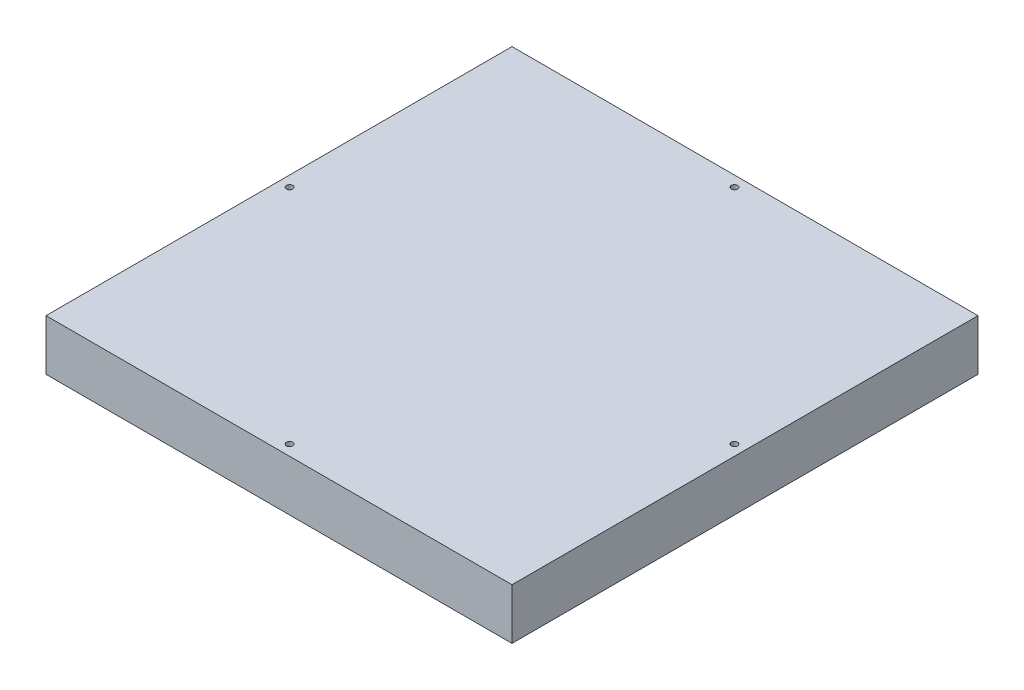
ISO-10303-21;
HEADER;
FILE_DESCRIPTION(('STEP AP214'),'2;1');
FILE_NAME('part.step','',(''),(''),'','','');
FILE_SCHEMA(('AUTOMOTIVE_DESIGN { 1 0 10303 214 1 1 1 1 }'));
ENDSEC;
DATA;
#1=APPLICATION_CONTEXT('core data for automotive mechanical design processes');
#2=APPLICATION_PROTOCOL_DEFINITION('international standard','automotive_design',2000,#1);
#3=PRODUCT_CONTEXT('',#1,'mechanical');
#4=PRODUCT('Part','Part','',(#3));
#5=PRODUCT_RELATED_PRODUCT_CATEGORY('part','',(#4));
#6=PRODUCT_DEFINITION_FORMATION('','',#4);
#7=PRODUCT_DEFINITION_CONTEXT('part definition',#1,'design');
#8=PRODUCT_DEFINITION('design','',#6,#7);
#9=PRODUCT_DEFINITION_SHAPE('','',#8);
#10=(LENGTH_UNIT() NAMED_UNIT(*) SI_UNIT(.MILLI.,.METRE.));
#11=(NAMED_UNIT(*) PLANE_ANGLE_UNIT() SI_UNIT($,.RADIAN.));
#12=(NAMED_UNIT(*) SI_UNIT($,.STERADIAN.) SOLID_ANGLE_UNIT());
#13=UNCERTAINTY_MEASURE_WITH_UNIT(LENGTH_MEASURE(1.E-05),#10,'distance_accuracy_value','');
#14=(GEOMETRIC_REPRESENTATION_CONTEXT(3) GLOBAL_UNCERTAINTY_ASSIGNED_CONTEXT((#13)) GLOBAL_UNIT_ASSIGNED_CONTEXT((#10,
#11,#12)) REPRESENTATION_CONTEXT('',''));
#15=CARTESIAN_POINT('',(0.,0.,0.));
#16=DIRECTION('',(0.,0.,1.));
#17=DIRECTION('',(1.,0.,0.));
#18=AXIS2_PLACEMENT_3D('',#15,#16,#17);
#19=CARTESIAN_POINT('',(0.,24.,0.));
#20=DIRECTION('',(0.,-1.,0.));
#21=DIRECTION('',(0.,0.,-1.));
#22=AXIS2_PLACEMENT_3D('',#19,#20,#21);
#23=PLANE('',#22);
#24=DIRECTION('',(0.,0.,-1.));
#25=VECTOR('',#24,1.);
#26=CARTESIAN_POINT('',(110.,24.,110.));
#27=LINE('',#26,#25);
#28=CARTESIAN_POINT('',(110.,24.,110.));
#29=VERTEX_POINT('',#28);
#30=CARTESIAN_POINT('',(110.,24.,-110.));
#31=VERTEX_POINT('',#30);
#32=EDGE_CURVE('E101',#29,#31,#27,.T.);
#33=ORIENTED_EDGE('',*,*,#32,.T.);
#34=DIRECTION('',(-1.,0.,0.));
#35=VECTOR('',#34,1.);
#36=CARTESIAN_POINT('',(-110.,24.,-110.));
#37=LINE('',#36,#35);
#38=CARTESIAN_POINT('',(-110.,24.,-110.));
#39=VERTEX_POINT('',#38);
#40=EDGE_CURVE('E95',#31,#39,#37,.T.);
#41=ORIENTED_EDGE('',*,*,#40,.T.);
#42=DIRECTION('',(0.,0.,1.));
#43=VECTOR('',#42,1.);
#44=CARTESIAN_POINT('',(-110.,24.,110.));
#45=LINE('',#44,#43);
#46=CARTESIAN_POINT('',(-110.,24.,110.));
#47=VERTEX_POINT('',#46);
#48=EDGE_CURVE('E99',#39,#47,#45,.T.);
#49=ORIENTED_EDGE('',*,*,#48,.T.);
#50=DIRECTION('',(1.,0.,0.));
#51=VECTOR('',#50,1.);
#52=CARTESIAN_POINT('',(-110.,24.,110.));
#53=LINE('',#52,#51);
#54=EDGE_CURVE('E64',#47,#29,#53,.T.);
#55=ORIENTED_EDGE('',*,*,#54,.T.);
#56=EDGE_LOOP('',(#33,#41,#49,#55));
#57=FACE_BOUND('',#56,.T.);
#58=CARTESIAN_POINT('',(-105.,24.,0.));
#59=DIRECTION('',(0.,1.,0.));
#60=DIRECTION('',(0.,0.,1.));
#61=AXIS2_PLACEMENT_3D('',#58,#59,#60);
#62=CIRCLE('',#61,1.5);
#63=CARTESIAN_POINT('',(-105.,24.,1.5));
#64=VERTEX_POINT('',#63);
#65=EDGE_CURVE('E150',#64,#64,#62,.T.);
#66=ORIENTED_EDGE('',*,*,#65,.F.);
#67=EDGE_LOOP('',(#66));
#68=FACE_BOUND('',#67,.T.);
#69=CARTESIAN_POINT('',(105.,24.,0.));
#70=DIRECTION('',(0.,1.,0.));
#71=DIRECTION('',(0.,0.,1.));
#72=AXIS2_PLACEMENT_3D('',#69,#70,#71);
#73=CIRCLE('',#72,1.5);
#74=CARTESIAN_POINT('',(105.,24.,1.5));
#75=VERTEX_POINT('',#74);
#76=EDGE_CURVE('E142',#75,#75,#73,.T.);
#77=ORIENTED_EDGE('',*,*,#76,.F.);
#78=EDGE_LOOP('',(#77));
#79=FACE_BOUND('',#78,.T.);
#80=CARTESIAN_POINT('',(0.,24.,105.));
#81=DIRECTION('',(0.,1.,0.));
#82=DIRECTION('',(0.,0.,1.));
#83=AXIS2_PLACEMENT_3D('',#80,#81,#82);
#84=CIRCLE('',#83,1.5);
#85=CARTESIAN_POINT('',(0.,24.,106.5));
#86=VERTEX_POINT('',#85);
#87=EDGE_CURVE('E128',#86,#86,#84,.T.);
#88=ORIENTED_EDGE('',*,*,#87,.F.);
#89=EDGE_LOOP('',(#88));
#90=FACE_BOUND('',#89,.T.);
#91=CARTESIAN_POINT('',(0.,24.,-105.));
#92=DIRECTION('',(0.,1.,0.));
#93=DIRECTION('',(0.,0.,1.));
#94=AXIS2_PLACEMENT_3D('',#91,#92,#93);
#95=CIRCLE('',#94,1.5);
#96=CARTESIAN_POINT('',(0.,24.,-103.5));
#97=VERTEX_POINT('',#96);
#98=EDGE_CURVE('E141',#97,#97,#95,.T.);
#99=ORIENTED_EDGE('',*,*,#98,.F.);
#100=EDGE_LOOP('',(#99));
#101=FACE_BOUND('',#100,.T.);
#102=ADVANCED_FACE('F46',(#57,#68,#79,#90,#101),#23,.F.);
#103=CARTESIAN_POINT('',(0.,0.,0.));
#104=DIRECTION('',(0.,-1.,0.));
#105=DIRECTION('',(0.,0.,-1.));
#106=AXIS2_PLACEMENT_3D('',#103,#104,#105);
#107=PLANE('',#106);
#108=CARTESIAN_POINT('',(0.,0.,105.));
#109=DIRECTION('',(0.,1.,0.));
#110=DIRECTION('',(0.,0.,1.));
#111=AXIS2_PLACEMENT_3D('',#108,#109,#110);
#112=CIRCLE('',#111,1.5);
#113=CARTESIAN_POINT('',(0.,0.,106.5));
#114=VERTEX_POINT('',#113);
#115=EDGE_CURVE('E134',#114,#114,#112,.T.);
#116=ORIENTED_EDGE('',*,*,#115,.T.);
#117=EDGE_LOOP('',(#116));
#118=FACE_BOUND('',#117,.T.);
#119=CARTESIAN_POINT('',(-105.,0.,0.));
#120=DIRECTION('',(0.,1.,0.));
#121=DIRECTION('',(0.,0.,1.));
#122=AXIS2_PLACEMENT_3D('',#119,#120,#121);
#123=CIRCLE('',#122,1.5);
#124=CARTESIAN_POINT('',(-105.,0.,1.5));
#125=VERTEX_POINT('',#124);
#126=EDGE_CURVE('E146',#125,#125,#123,.T.);
#127=ORIENTED_EDGE('',*,*,#126,.T.);
#128=EDGE_LOOP('',(#127));
#129=FACE_BOUND('',#128,.T.);
#130=DIRECTION('',(0.,0.,-1.));
#131=VECTOR('',#130,1.);
#132=CARTESIAN_POINT('',(110.,0.,110.));
#133=LINE('',#132,#131);
#134=CARTESIAN_POINT('',(110.,0.,110.));
#135=VERTEX_POINT('',#134);
#136=CARTESIAN_POINT('',(110.,0.,-110.));
#137=VERTEX_POINT('',#136);
#138=EDGE_CURVE('E154',#135,#137,#133,.T.);
#139=ORIENTED_EDGE('',*,*,#138,.F.);
#140=DIRECTION('',(1.,0.,0.));
#141=VECTOR('',#140,1.);
#142=CARTESIAN_POINT('',(-110.,0.,110.));
#143=LINE('',#142,#141);
#144=CARTESIAN_POINT('',(-110.,0.,110.));
#145=VERTEX_POINT('',#144);
#146=EDGE_CURVE('E88',#145,#135,#143,.T.);
#147=ORIENTED_EDGE('',*,*,#146,.F.);
#148=DIRECTION('',(0.,0.,1.));
#149=VECTOR('',#148,1.);
#150=CARTESIAN_POINT('',(-110.,0.,110.));
#151=LINE('',#150,#149);
#152=CARTESIAN_POINT('',(-110.,0.,-110.));
#153=VERTEX_POINT('',#152);
#154=EDGE_CURVE('E82',#153,#145,#151,.T.);
#155=ORIENTED_EDGE('',*,*,#154,.F.);
#156=DIRECTION('',(-1.,0.,0.));
#157=VECTOR('',#156,1.);
#158=CARTESIAN_POINT('',(-110.,0.,-110.));
#159=LINE('',#158,#157);
#160=EDGE_CURVE('E106',#137,#153,#159,.T.);
#161=ORIENTED_EDGE('',*,*,#160,.F.);
#162=EDGE_LOOP('',(#139,#147,#155,#161));
#163=FACE_BOUND('',#162,.T.);
#164=CARTESIAN_POINT('',(105.,0.,0.));
#165=DIRECTION('',(0.,1.,0.));
#166=DIRECTION('',(0.,0.,1.));
#167=AXIS2_PLACEMENT_3D('',#164,#165,#166);
#168=CIRCLE('',#167,1.5);
#169=CARTESIAN_POINT('',(105.,0.,1.5));
#170=VERTEX_POINT('',#169);
#171=EDGE_CURVE('E133',#170,#170,#168,.T.);
#172=ORIENTED_EDGE('',*,*,#171,.T.);
#173=EDGE_LOOP('',(#172));
#174=FACE_BOUND('',#173,.T.);
#175=CARTESIAN_POINT('',(0.,0.,-105.));
#176=DIRECTION('',(0.,1.,0.));
#177=DIRECTION('',(0.,0.,1.));
#178=AXIS2_PLACEMENT_3D('',#175,#176,#177);
#179=CIRCLE('',#178,1.5);
#180=CARTESIAN_POINT('',(0.,0.,-103.5));
#181=VERTEX_POINT('',#180);
#182=EDGE_CURVE('E135',#181,#181,#179,.T.);
#183=ORIENTED_EDGE('',*,*,#182,.T.);
#184=EDGE_LOOP('',(#183));
#185=FACE_BOUND('',#184,.T.);
#186=ADVANCED_FACE('F209',(#118,#129,#163,#174,#185),#107,.T.);
#187=CARTESIAN_POINT('',(110.,24.,110.));
#188=DIRECTION('',(-1.,0.,0.));
#189=DIRECTION('',(0.,0.,1.));
#190=AXIS2_PLACEMENT_3D('',#187,#188,#189);
#191=PLANE('',#190);
#192=ORIENTED_EDGE('',*,*,#138,.T.);
#193=DIRECTION('',(0.,-1.,0.));
#194=VECTOR('',#193,1.);
#195=CARTESIAN_POINT('',(110.,24.,-110.));
#196=LINE('',#195,#194);
#197=EDGE_CURVE('E12',#31,#137,#196,.T.);
#198=ORIENTED_EDGE('',*,*,#197,.F.);
#199=ORIENTED_EDGE('',*,*,#32,.F.);
#200=DIRECTION('',(0.,-1.,0.));
#201=VECTOR('',#200,1.);
#202=CARTESIAN_POINT('',(110.,24.,110.));
#203=LINE('',#202,#201);
#204=EDGE_CURVE('E113',#29,#135,#203,.T.);
#205=ORIENTED_EDGE('',*,*,#204,.T.);
#206=EDGE_LOOP('',(#192,#198,#199,#205));
#207=FACE_BOUND('',#206,.T.);
#208=ADVANCED_FACE('F48',(#207),#191,.F.);
#209=CARTESIAN_POINT('',(-110.,24.,-110.));
#210=DIRECTION('',(0.,0.,1.));
#211=DIRECTION('',(1.,0.,0.));
#212=AXIS2_PLACEMENT_3D('',#209,#210,#211);
#213=PLANE('',#212);
#214=ORIENTED_EDGE('',*,*,#160,.T.);
#215=DIRECTION('',(0.,-1.,0.));
#216=VECTOR('',#215,1.);
#217=CARTESIAN_POINT('',(-110.,24.,-110.));
#218=LINE('',#217,#216);
#219=EDGE_CURVE('E56',#39,#153,#218,.T.);
#220=ORIENTED_EDGE('',*,*,#219,.F.);
#221=ORIENTED_EDGE('',*,*,#40,.F.);
#222=ORIENTED_EDGE('',*,*,#197,.T.);
#223=EDGE_LOOP('',(#214,#220,#221,#222));
#224=FACE_BOUND('',#223,.T.);
#225=ADVANCED_FACE('F105',(#224),#213,.F.);
#226=CARTESIAN_POINT('',(-110.,24.,110.));
#227=DIRECTION('',(1.,0.,0.));
#228=DIRECTION('',(0.,0.,-1.));
#229=AXIS2_PLACEMENT_3D('',#226,#227,#228);
#230=PLANE('',#229);
#231=ORIENTED_EDGE('',*,*,#154,.T.);
#232=DIRECTION('',(0.,-1.,0.));
#233=VECTOR('',#232,1.);
#234=CARTESIAN_POINT('',(-110.,24.,110.));
#235=LINE('',#234,#233);
#236=EDGE_CURVE('E108',#47,#145,#235,.T.);
#237=ORIENTED_EDGE('',*,*,#236,.F.);
#238=ORIENTED_EDGE('',*,*,#48,.F.);
#239=ORIENTED_EDGE('',*,*,#219,.T.);
#240=EDGE_LOOP('',(#231,#237,#238,#239));
#241=FACE_BOUND('',#240,.T.);
#242=ADVANCED_FACE('F109',(#241),#230,.F.);
#243=CARTESIAN_POINT('',(-110.,24.,110.));
#244=DIRECTION('',(0.,0.,-1.));
#245=DIRECTION('',(-1.,0.,0.));
#246=AXIS2_PLACEMENT_3D('',#243,#244,#245);
#247=PLANE('',#246);
#248=ORIENTED_EDGE('',*,*,#146,.T.);
#249=ORIENTED_EDGE('',*,*,#204,.F.);
#250=ORIENTED_EDGE('',*,*,#54,.F.);
#251=ORIENTED_EDGE('',*,*,#236,.T.);
#252=EDGE_LOOP('',(#248,#249,#250,#251));
#253=FACE_BOUND('',#252,.T.);
#254=ADVANCED_FACE('F234',(#253),#247,.F.);
#255=CARTESIAN_POINT('',(-105.,24.,0.));
#256=DIRECTION('',(0.,-1.,0.));
#257=DIRECTION('',(0.,0.,-1.));
#258=AXIS2_PLACEMENT_3D('',#255,#256,#257);
#259=CYLINDRICAL_SURFACE('',#258,1.5);
#260=ORIENTED_EDGE('',*,*,#65,.T.);
#261=EDGE_LOOP('',(#260));
#262=FACE_BOUND('',#261,.T.);
#263=ORIENTED_EDGE('',*,*,#126,.F.);
#264=EDGE_LOOP('',(#263));
#265=FACE_BOUND('',#264,.T.);
#266=ADVANCED_FACE('F231',(#262,#265),#259,.F.);
#267=CARTESIAN_POINT('',(105.,24.,0.));
#268=DIRECTION('',(0.,-1.,0.));
#269=DIRECTION('',(0.,0.,-1.));
#270=AXIS2_PLACEMENT_3D('',#267,#268,#269);
#271=CYLINDRICAL_SURFACE('',#270,1.5);
#272=ORIENTED_EDGE('',*,*,#76,.T.);
#273=EDGE_LOOP('',(#272));
#274=FACE_BOUND('',#273,.T.);
#275=ORIENTED_EDGE('',*,*,#171,.F.);
#276=EDGE_LOOP('',(#275));
#277=FACE_BOUND('',#276,.T.);
#278=ADVANCED_FACE('F263',(#274,#277),#271,.F.);
#279=CARTESIAN_POINT('',(0.,24.,105.));
#280=DIRECTION('',(0.,-1.,0.));
#281=DIRECTION('',(0.,0.,-1.));
#282=AXIS2_PLACEMENT_3D('',#279,#280,#281);
#283=CYLINDRICAL_SURFACE('',#282,1.5);
#284=ORIENTED_EDGE('',*,*,#87,.T.);
#285=EDGE_LOOP('',(#284));
#286=FACE_BOUND('',#285,.T.);
#287=ORIENTED_EDGE('',*,*,#115,.F.);
#288=EDGE_LOOP('',(#287));
#289=FACE_BOUND('',#288,.T.);
#290=ADVANCED_FACE('F257',(#286,#289),#283,.F.);
#291=CARTESIAN_POINT('',(0.,24.,-105.));
#292=DIRECTION('',(0.,-1.,0.));
#293=DIRECTION('',(0.,0.,-1.));
#294=AXIS2_PLACEMENT_3D('',#291,#292,#293);
#295=CYLINDRICAL_SURFACE('',#294,1.5);
#296=ORIENTED_EDGE('',*,*,#98,.T.);
#297=EDGE_LOOP('',(#296));
#298=FACE_BOUND('',#297,.T.);
#299=ORIENTED_EDGE('',*,*,#182,.F.);
#300=EDGE_LOOP('',(#299));
#301=FACE_BOUND('',#300,.T.);
#302=ADVANCED_FACE('F224',(#298,#301),#295,.F.);
#303=CLOSED_SHELL('',(#102,#186,#208,#225,#242,#254,#266,#278,#290,#302));
#304=MANIFOLD_SOLID_BREP('B2',#303);
#305=ADVANCED_BREP_SHAPE_REPRESENTATION('',(#18,#304),#14);
#306=SHAPE_DEFINITION_REPRESENTATION(#9,#305);
ENDSEC;
END-ISO-10303-21;
